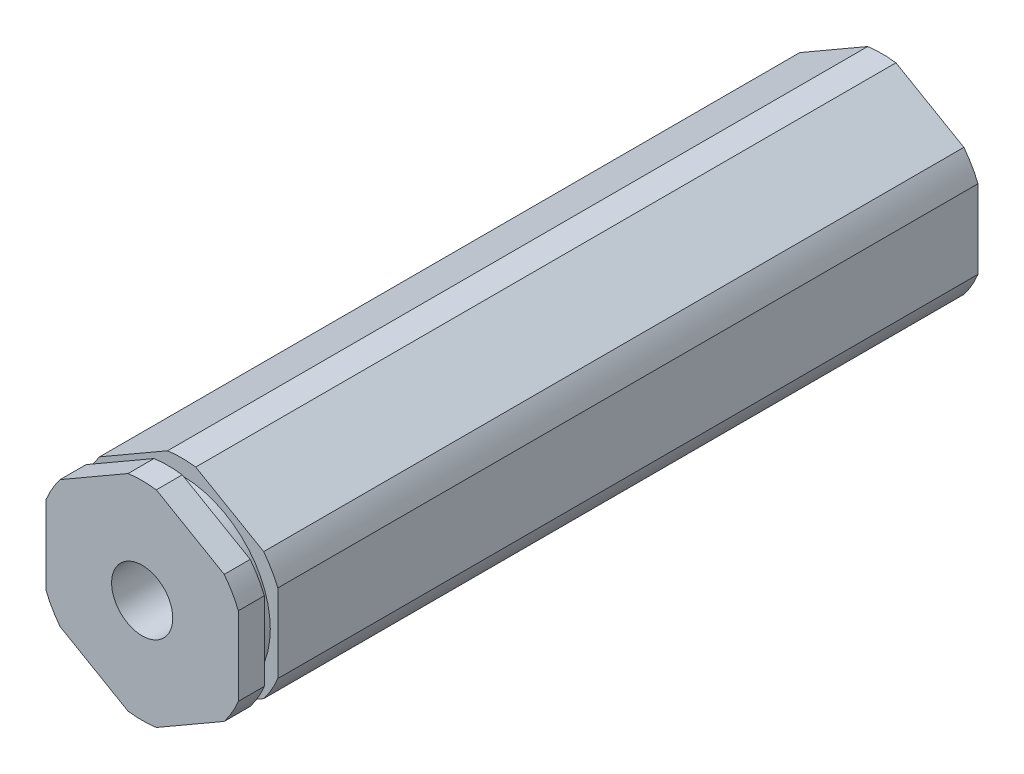
ISO-10303-21;
HEADER;
FILE_DESCRIPTION(('STEP AP214'),'2;1');
FILE_NAME('part.step','',(''),(''),'','','');
FILE_SCHEMA(('AUTOMOTIVE_DESIGN { 1 0 10303 214 1 1 1 1 }'));
ENDSEC;
DATA;
#1=APPLICATION_CONTEXT('core data for automotive mechanical design processes');
#2=APPLICATION_PROTOCOL_DEFINITION('international standard','automotive_design',2000,#1);
#3=PRODUCT_CONTEXT('',#1,'mechanical');
#4=PRODUCT('Part','Part','',(#3));
#5=PRODUCT_RELATED_PRODUCT_CATEGORY('part','',(#4));
#6=PRODUCT_DEFINITION_FORMATION('','',#4);
#7=PRODUCT_DEFINITION_CONTEXT('part definition',#1,'design');
#8=PRODUCT_DEFINITION('design','',#6,#7);
#9=PRODUCT_DEFINITION_SHAPE('','',#8);
#10=(LENGTH_UNIT() NAMED_UNIT(*) SI_UNIT(.MILLI.,.METRE.));
#11=(NAMED_UNIT(*) PLANE_ANGLE_UNIT() SI_UNIT($,.RADIAN.));
#12=(NAMED_UNIT(*) SI_UNIT($,.STERADIAN.) SOLID_ANGLE_UNIT());
#13=UNCERTAINTY_MEASURE_WITH_UNIT(LENGTH_MEASURE(1.E-05),#10,'distance_accuracy_value','');
#14=(GEOMETRIC_REPRESENTATION_CONTEXT(3) GLOBAL_UNCERTAINTY_ASSIGNED_CONTEXT((#13)) GLOBAL_UNIT_ASSIGNED_CONTEXT((#10,
#11,#12)) REPRESENTATION_CONTEXT('',''));
#15=CARTESIAN_POINT('',(0.,0.,0.));
#16=DIRECTION('',(0.,0.,1.));
#17=DIRECTION('',(1.,0.,0.));
#18=AXIS2_PLACEMENT_3D('',#15,#16,#17);
#19=CARTESIAN_POINT('',(6.35,0.,24.41575));
#20=DIRECTION('',(-1.,0.,0.));
#21=DIRECTION('',(0.,-1.,0.));
#22=AXIS2_PLACEMENT_3D('',#19,#20,#21);
#23=PLANE('',#22);
#24=DIRECTION('',(0.,-1.,0.));
#25=VECTOR('',#24,1.);
#26=CARTESIAN_POINT('',(6.35,0.,22.70125));
#27=LINE('',#26,#25);
#28=CARTESIAN_POINT('',(6.35,2.59030191290513,22.70125));
#29=VERTEX_POINT('',#28);
#30=CARTESIAN_POINT('',(6.35,-2.59030191290513,22.70125));
#31=VERTEX_POINT('',#30);
#32=EDGE_CURVE('E79',#29,#31,#27,.T.);
#33=ORIENTED_EDGE('',*,*,#32,.F.);
#34=DIRECTION('',(0.,0.,-1.));
#35=VECTOR('',#34,1.);
#36=CARTESIAN_POINT('',(6.35,2.59030191290513,24.41575));
#37=LINE('',#36,#35);
#38=CARTESIAN_POINT('',(6.35,2.59030191290513,24.41575));
#39=VERTEX_POINT('',#38);
#40=EDGE_CURVE('E250',#39,#29,#37,.T.);
#41=ORIENTED_EDGE('',*,*,#40,.F.);
#42=DIRECTION('',(0.,1.,0.));
#43=VECTOR('',#42,1.);
#44=CARTESIAN_POINT('',(6.35,0.,24.41575));
#45=LINE('',#44,#43);
#46=CARTESIAN_POINT('',(6.35,-2.59030191290513,24.41575));
#47=VERTEX_POINT('',#46);
#48=EDGE_CURVE('E364',#47,#39,#45,.T.);
#49=ORIENTED_EDGE('',*,*,#48,.F.);
#50=DIRECTION('',(0.,0.,-1.));
#51=VECTOR('',#50,1.);
#52=CARTESIAN_POINT('',(6.35,-2.59030191290513,24.41575));
#53=LINE('',#52,#51);
#54=EDGE_CURVE('E305',#47,#31,#53,.T.);
#55=ORIENTED_EDGE('',*,*,#54,.T.);
#56=EDGE_LOOP('',(#33,#41,#49,#55));
#57=FACE_BOUND('',#56,.T.);
#58=ADVANCED_FACE('F57',(#57),#23,.F.);
#59=CARTESIAN_POINT('',(0.,0.,24.41575));
#60=DIRECTION('',(0.,0.,-1.));
#61=DIRECTION('',(-1.,0.,0.));
#62=AXIS2_PLACEMENT_3D('',#59,#60,#61);
#63=CYLINDRICAL_SURFACE('',#62,6.858);
#64=CARTESIAN_POINT('',(0.,0.,22.70125));
#65=DIRECTION('',(0.,0.,1.));
#66=DIRECTION('',(1.,0.,0.));
#67=AXIS2_PLACEMENT_3D('',#64,#65,#66);
#68=CIRCLE('',#67,6.858);
#69=CARTESIAN_POINT('',(5.41826726004727,4.20411035757862,22.70125));
#70=VERTEX_POINT('',#69);
#71=EDGE_CURVE('E419',#29,#70,#68,.T.);
#72=ORIENTED_EDGE('',*,*,#71,.T.);
#73=DIRECTION('',(0.,0.,-1.));
#74=VECTOR('',#73,1.);
#75=CARTESIAN_POINT('',(5.41826726004727,4.20411035757862,24.41575));
#76=LINE('',#75,#74);
#77=CARTESIAN_POINT('',(5.41826726004727,4.20411035757862,24.41575));
#78=VERTEX_POINT('',#77);
#79=EDGE_CURVE('E251',#78,#70,#76,.T.);
#80=ORIENTED_EDGE('',*,*,#79,.F.);
#81=CARTESIAN_POINT('',(0.,0.,24.41575));
#82=DIRECTION('',(0.,0.,1.));
#83=DIRECTION('',(1.,0.,0.));
#84=AXIS2_PLACEMENT_3D('',#81,#82,#83);
#85=CIRCLE('',#84,6.858);
#86=EDGE_CURVE('E361',#39,#78,#85,.T.);
#87=ORIENTED_EDGE('',*,*,#86,.F.);
#88=ORIENTED_EDGE('',*,*,#40,.T.);
#89=EDGE_LOOP('',(#72,#80,#87,#88));
#90=FACE_BOUND('',#89,.T.);
#91=ADVANCED_FACE('F549',(#90),#63,.T.);
#92=CARTESIAN_POINT('',(3.175,5.49926131403119,24.41575));
#93=DIRECTION('',(-0.5,-0.866025403784439,0.));
#94=DIRECTION('',(0.866025403784438,-0.5,0.));
#95=AXIS2_PLACEMENT_3D('',#92,#93,#94);
#96=PLANE('',#95);
#97=DIRECTION('',(0.866025403784438,-0.5,0.));
#98=VECTOR('',#97,1.);
#99=CARTESIAN_POINT('',(3.175,5.49926131403119,22.70125));
#100=LINE('',#99,#98);
#101=CARTESIAN_POINT('',(0.931732739952733,6.79441227048375,22.70125));
#102=VERTEX_POINT('',#101);
#103=EDGE_CURVE('E385',#102,#70,#100,.T.);
#104=ORIENTED_EDGE('',*,*,#103,.F.);
#105=DIRECTION('',(0.,0.,-1.));
#106=VECTOR('',#105,1.);
#107=CARTESIAN_POINT('',(0.931732739952733,6.79441227048375,24.41575));
#108=LINE('',#107,#106);
#109=CARTESIAN_POINT('',(0.931732739952733,6.79441227048375,24.41575));
#110=VERTEX_POINT('',#109);
#111=EDGE_CURVE('E260',#110,#102,#108,.T.);
#112=ORIENTED_EDGE('',*,*,#111,.F.);
#113=DIRECTION('',(-0.866025403784439,0.5,0.));
#114=VECTOR('',#113,1.);
#115=CARTESIAN_POINT('',(3.175,5.49926131403119,24.41575));
#116=LINE('',#115,#114);
#117=EDGE_CURVE('E358',#78,#110,#116,.T.);
#118=ORIENTED_EDGE('',*,*,#117,.F.);
#119=ORIENTED_EDGE('',*,*,#79,.T.);
#120=EDGE_LOOP('',(#104,#112,#118,#119));
#121=FACE_BOUND('',#120,.T.);
#122=ADVANCED_FACE('F561',(#121),#96,.F.);
#123=CARTESIAN_POINT('',(-0.931732739952732,6.79441227048375,22.70125));
#124=VERTEX_POINT('',#123);
#125=EDGE_CURVE('E422',#102,#124,#68,.T.);
#126=ORIENTED_EDGE('',*,*,#125,.T.);
#127=DIRECTION('',(0.,0.,-1.));
#128=VECTOR('',#127,1.);
#129=CARTESIAN_POINT('',(-0.931732739952731,6.79441227048375,24.41575));
#130=LINE('',#129,#128);
#131=CARTESIAN_POINT('',(-0.931732739952731,6.79441227048375,24.41575));
#132=VERTEX_POINT('',#131);
#133=EDGE_CURVE('E265',#132,#124,#130,.T.);
#134=ORIENTED_EDGE('',*,*,#133,.F.);
#135=EDGE_CURVE('E357',#110,#132,#85,.T.);
#136=ORIENTED_EDGE('',*,*,#135,.F.);
#137=ORIENTED_EDGE('',*,*,#111,.T.);
#138=EDGE_LOOP('',(#126,#134,#136,#137));
#139=FACE_BOUND('',#138,.T.);
#140=ADVANCED_FACE('F566',(#139),#63,.T.);
#141=CARTESIAN_POINT('',(-3.175,5.49926131403119,24.41575));
#142=DIRECTION('',(0.5,-0.866025403784439,0.));
#143=DIRECTION('',(0.866025403784438,0.5,0.));
#144=AXIS2_PLACEMENT_3D('',#141,#142,#143);
#145=PLANE('',#144);
#146=DIRECTION('',(0.866025403784438,0.5,0.));
#147=VECTOR('',#146,1.);
#148=CARTESIAN_POINT('',(-3.175,5.49926131403119,22.70125));
#149=LINE('',#148,#147);
#150=CARTESIAN_POINT('',(-5.41826726004727,4.20411035757862,22.70125));
#151=VERTEX_POINT('',#150);
#152=EDGE_CURVE('E388',#151,#124,#149,.T.);
#153=ORIENTED_EDGE('',*,*,#152,.F.);
#154=DIRECTION('',(0.,0.,-1.));
#155=VECTOR('',#154,1.);
#156=CARTESIAN_POINT('',(-5.41826726004727,4.20411035757862,24.41575));
#157=LINE('',#156,#155);
#158=CARTESIAN_POINT('',(-5.41826726004727,4.20411035757862,24.41575));
#159=VERTEX_POINT('',#158);
#160=EDGE_CURVE('E270',#159,#151,#157,.T.);
#161=ORIENTED_EDGE('',*,*,#160,.F.);
#162=DIRECTION('',(-0.866025403784439,-0.5,0.));
#163=VECTOR('',#162,1.);
#164=CARTESIAN_POINT('',(-3.175,5.49926131403119,24.41575));
#165=LINE('',#164,#163);
#166=EDGE_CURVE('E354',#132,#159,#165,.T.);
#167=ORIENTED_EDGE('',*,*,#166,.F.);
#168=ORIENTED_EDGE('',*,*,#133,.T.);
#169=EDGE_LOOP('',(#153,#161,#167,#168));
#170=FACE_BOUND('',#169,.T.);
#171=ADVANCED_FACE('F571',(#170),#145,.F.);
#172=CARTESIAN_POINT('',(-6.35,2.59030191290514,22.70125));
#173=VERTEX_POINT('',#172);
#174=EDGE_CURVE('E430',#151,#173,#68,.T.);
#175=ORIENTED_EDGE('',*,*,#174,.T.);
#176=DIRECTION('',(0.,0.,-1.));
#177=VECTOR('',#176,1.);
#178=CARTESIAN_POINT('',(-6.35,2.59030191290514,24.41575));
#179=LINE('',#178,#177);
#180=CARTESIAN_POINT('',(-6.35,2.59030191290514,24.41575));
#181=VERTEX_POINT('',#180);
#182=EDGE_CURVE('E275',#181,#173,#179,.T.);
#183=ORIENTED_EDGE('',*,*,#182,.F.);
#184=EDGE_CURVE('E353',#159,#181,#85,.T.);
#185=ORIENTED_EDGE('',*,*,#184,.F.);
#186=ORIENTED_EDGE('',*,*,#160,.T.);
#187=EDGE_LOOP('',(#175,#183,#185,#186));
#188=FACE_BOUND('',#187,.T.);
#189=ADVANCED_FACE('F444',(#188),#63,.T.);
#190=CARTESIAN_POINT('',(-6.35,0.,24.41575));
#191=DIRECTION('',(1.,0.,0.));
#192=DIRECTION('',(0.,1.,0.));
#193=AXIS2_PLACEMENT_3D('',#190,#191,#192);
#194=PLANE('',#193);
#195=DIRECTION('',(0.,1.,0.));
#196=VECTOR('',#195,1.);
#197=CARTESIAN_POINT('',(-6.35,0.,22.70125));
#198=LINE('',#197,#196);
#199=CARTESIAN_POINT('',(-6.35,-2.59030191290514,22.70125));
#200=VERTEX_POINT('',#199);
#201=EDGE_CURVE('E391',#200,#173,#198,.T.);
#202=ORIENTED_EDGE('',*,*,#201,.F.);
#203=DIRECTION('',(0.,0.,-1.));
#204=VECTOR('',#203,1.);
#205=CARTESIAN_POINT('',(-6.35,-2.59030191290514,24.41575));
#206=LINE('',#205,#204);
#207=CARTESIAN_POINT('',(-6.35,-2.59030191290514,24.41575));
#208=VERTEX_POINT('',#207);
#209=EDGE_CURVE('E280',#208,#200,#206,.T.);
#210=ORIENTED_EDGE('',*,*,#209,.F.);
#211=DIRECTION('',(0.,-1.,0.));
#212=VECTOR('',#211,1.);
#213=CARTESIAN_POINT('',(-6.35,0.,24.41575));
#214=LINE('',#213,#212);
#215=EDGE_CURVE('E350',#181,#208,#214,.T.);
#216=ORIENTED_EDGE('',*,*,#215,.F.);
#217=ORIENTED_EDGE('',*,*,#182,.T.);
#218=EDGE_LOOP('',(#202,#210,#216,#217));
#219=FACE_BOUND('',#218,.T.);
#220=ADVANCED_FACE('F451',(#219),#194,.F.);
#221=CARTESIAN_POINT('',(-5.41826726004727,-4.20411035757862,22.70125));
#222=VERTEX_POINT('',#221);
#223=EDGE_CURVE('E433',#200,#222,#68,.T.);
#224=ORIENTED_EDGE('',*,*,#223,.T.);
#225=DIRECTION('',(0.,0.,-1.));
#226=VECTOR('',#225,1.);
#227=CARTESIAN_POINT('',(-5.41826726004728,-4.20411035757862,24.41575));
#228=LINE('',#227,#226);
#229=CARTESIAN_POINT('',(-5.41826726004728,-4.20411035757862,24.41575));
#230=VERTEX_POINT('',#229);
#231=EDGE_CURVE('E285',#230,#222,#228,.T.);
#232=ORIENTED_EDGE('',*,*,#231,.F.);
#233=EDGE_CURVE('E349',#208,#230,#85,.T.);
#234=ORIENTED_EDGE('',*,*,#233,.F.);
#235=ORIENTED_EDGE('',*,*,#209,.T.);
#236=EDGE_LOOP('',(#224,#232,#234,#235));
#237=FACE_BOUND('',#236,.T.);
#238=ADVANCED_FACE('F540',(#237),#63,.T.);
#239=CARTESIAN_POINT('',(-3.175,-5.49926131403118,24.41575));
#240=DIRECTION('',(0.5,0.866025403784439,0.));
#241=DIRECTION('',(-0.866025403784439,0.5,0.));
#242=AXIS2_PLACEMENT_3D('',#239,#240,#241);
#243=PLANE('',#242);
#244=DIRECTION('',(-0.866025403784439,0.5,0.));
#245=VECTOR('',#244,1.);
#246=CARTESIAN_POINT('',(-3.175,-5.49926131403118,22.70125));
#247=LINE('',#246,#245);
#248=CARTESIAN_POINT('',(-0.931732739952721,-6.79441227048375,22.70125));
#249=VERTEX_POINT('',#248);
#250=EDGE_CURVE('E394',#249,#222,#247,.T.);
#251=ORIENTED_EDGE('',*,*,#250,.F.);
#252=DIRECTION('',(0.,0.,-1.));
#253=VECTOR('',#252,1.);
#254=CARTESIAN_POINT('',(-0.931732739952721,-6.79441227048375,24.41575));
#255=LINE('',#254,#253);
#256=CARTESIAN_POINT('',(-0.931732739952721,-6.79441227048375,24.41575));
#257=VERTEX_POINT('',#256);
#258=EDGE_CURVE('E290',#257,#249,#255,.T.);
#259=ORIENTED_EDGE('',*,*,#258,.F.);
#260=DIRECTION('',(0.866025403784439,-0.5,0.));
#261=VECTOR('',#260,1.);
#262=CARTESIAN_POINT('',(-3.175,-5.49926131403118,24.41575));
#263=LINE('',#262,#261);
#264=EDGE_CURVE('E346',#230,#257,#263,.T.);
#265=ORIENTED_EDGE('',*,*,#264,.F.);
#266=ORIENTED_EDGE('',*,*,#231,.T.);
#267=EDGE_LOOP('',(#251,#259,#265,#266));
#268=FACE_BOUND('',#267,.T.);
#269=ADVANCED_FACE('F548',(#268),#243,.F.);
#270=CARTESIAN_POINT('',(0.931732739952729,-6.79441227048375,22.70125));
#271=VERTEX_POINT('',#270);
#272=EDGE_CURVE('E423',#249,#271,#68,.T.);
#273=ORIENTED_EDGE('',*,*,#272,.T.);
#274=DIRECTION('',(0.,0.,-1.));
#275=VECTOR('',#274,1.);
#276=CARTESIAN_POINT('',(0.931732739952731,-6.79441227048375,24.41575));
#277=LINE('',#276,#275);
#278=CARTESIAN_POINT('',(0.931732739952731,-6.79441227048375,24.41575));
#279=VERTEX_POINT('',#278);
#280=EDGE_CURVE('E295',#279,#271,#277,.T.);
#281=ORIENTED_EDGE('',*,*,#280,.F.);
#282=EDGE_CURVE('E345',#257,#279,#85,.T.);
#283=ORIENTED_EDGE('',*,*,#282,.F.);
#284=ORIENTED_EDGE('',*,*,#258,.T.);
#285=EDGE_LOOP('',(#273,#281,#283,#284));
#286=FACE_BOUND('',#285,.T.);
#287=ADVANCED_FACE('F539',(#286),#63,.T.);
#288=CARTESIAN_POINT('',(3.175,-5.49926131403118,24.41575));
#289=DIRECTION('',(-0.5,0.866025403784439,0.));
#290=DIRECTION('',(-0.866025403784439,-0.5,0.));
#291=AXIS2_PLACEMENT_3D('',#288,#289,#290);
#292=PLANE('',#291);
#293=DIRECTION('',(-0.866025403784439,-0.5,0.));
#294=VECTOR('',#293,1.);
#295=CARTESIAN_POINT('',(3.175,-5.49926131403118,22.70125));
#296=LINE('',#295,#294);
#297=CARTESIAN_POINT('',(5.41826726004727,-4.20411035757862,22.70125));
#298=VERTEX_POINT('',#297);
#299=EDGE_CURVE('E230',#298,#271,#296,.T.);
#300=ORIENTED_EDGE('',*,*,#299,.F.);
#301=DIRECTION('',(0.,0.,-1.));
#302=VECTOR('',#301,1.);
#303=CARTESIAN_POINT('',(5.41826726004727,-4.20411035757862,24.41575));
#304=LINE('',#303,#302);
#305=CARTESIAN_POINT('',(5.41826726004727,-4.20411035757862,24.41575));
#306=VERTEX_POINT('',#305);
#307=EDGE_CURVE('E300',#306,#298,#304,.T.);
#308=ORIENTED_EDGE('',*,*,#307,.F.);
#309=DIRECTION('',(0.866025403784439,0.5,0.));
#310=VECTOR('',#309,1.);
#311=CARTESIAN_POINT('',(3.175,-5.49926131403118,24.41575));
#312=LINE('',#311,#310);
#313=EDGE_CURVE('E341',#279,#306,#312,.T.);
#314=ORIENTED_EDGE('',*,*,#313,.F.);
#315=ORIENTED_EDGE('',*,*,#280,.T.);
#316=EDGE_LOOP('',(#300,#308,#314,#315));
#317=FACE_BOUND('',#316,.T.);
#318=ADVANCED_FACE('F553',(#317),#292,.F.);
#319=CARTESIAN_POINT('',(0.,0.,22.70125));
#320=DIRECTION('',(0.,0.,-1.));
#321=DIRECTION('',(-1.,0.,0.));
#322=AXIS2_PLACEMENT_3D('',#319,#320,#321);
#323=CIRCLE('',#322,6.858);
#324=EDGE_CURVE('E11',#31,#298,#323,.T.);
#325=ORIENTED_EDGE('',*,*,#324,.F.);
#326=ORIENTED_EDGE('',*,*,#54,.F.);
#327=EDGE_CURVE('E344',#306,#47,#85,.T.);
#328=ORIENTED_EDGE('',*,*,#327,.F.);
#329=ORIENTED_EDGE('',*,*,#307,.T.);
#330=EDGE_LOOP('',(#325,#326,#328,#329));
#331=FACE_BOUND('',#330,.T.);
#332=ADVANCED_FACE('F682',(#331),#63,.T.);
#333=CARTESIAN_POINT('',(0.,0.,24.41575));
#334=DIRECTION('',(0.,0.,1.));
#335=DIRECTION('',(1.,0.,0.));
#336=AXIS2_PLACEMENT_3D('',#333,#334,#335);
#337=PLANE('',#336);
#338=CARTESIAN_POINT('',(0.,0.,24.41575));
#339=DIRECTION('',(0.,0.,1.));
#340=DIRECTION('',(1.,0.,0.));
#341=AXIS2_PLACEMENT_3D('',#338,#339,#340);
#342=CIRCLE('',#341,2.01929999999999);
#343=CARTESIAN_POINT('',(2.01929999999999,0.,24.41575));
#344=VERTEX_POINT('',#343);
#345=EDGE_CURVE('E379',#344,#344,#342,.T.);
#346=ORIENTED_EDGE('',*,*,#345,.F.);
#347=EDGE_LOOP('',(#346));
#348=FACE_BOUND('',#347,.T.);
#349=ORIENTED_EDGE('',*,*,#48,.T.);
#350=ORIENTED_EDGE('',*,*,#86,.T.);
#351=ORIENTED_EDGE('',*,*,#117,.T.);
#352=ORIENTED_EDGE('',*,*,#135,.T.);
#353=ORIENTED_EDGE('',*,*,#166,.T.);
#354=ORIENTED_EDGE('',*,*,#184,.T.);
#355=ORIENTED_EDGE('',*,*,#215,.T.);
#356=ORIENTED_EDGE('',*,*,#233,.T.);
#357=ORIENTED_EDGE('',*,*,#264,.T.);
#358=ORIENTED_EDGE('',*,*,#282,.T.);
#359=ORIENTED_EDGE('',*,*,#313,.T.);
#360=ORIENTED_EDGE('',*,*,#327,.T.);
#361=EDGE_LOOP('',(#349,#350,#351,#352,#353,#354,#355,#356,#357,#358,#359,#360));
#362=FACE_BOUND('',#361,.T.);
#363=ADVANCED_FACE('F455',(#348,#362),#337,.T.);
#364=CARTESIAN_POINT('',(0.,0.,8.06831000000001));
#365=DIRECTION('',(0.,0.,1.));
#366=DIRECTION('',(1.,0.,0.));
#367=AXIS2_PLACEMENT_3D('',#364,#365,#366);
#368=CONICAL_SURFACE('',#367,2.01929999999999,1.02974425867665);
#369=CARTESIAN_POINT('',(0.,0.,6.85499215199765));
#370=VERTEX_POINT('',#369);
#371=VERTEX_LOOP('',#370);
#372=FACE_BOUND('',#371,.T.);
#373=CARTESIAN_POINT('',(0.,0.,8.06831000000001));
#374=DIRECTION('',(0.,0.,1.));
#375=DIRECTION('',(1.,0.,0.));
#376=AXIS2_PLACEMENT_3D('',#373,#374,#375);
#377=CIRCLE('',#376,2.01929999999999);
#378=CARTESIAN_POINT('',(2.01929999999999,0.,8.06831000000001));
#379=VERTEX_POINT('',#378);
#380=EDGE_CURVE('E375',#379,#379,#377,.T.);
#381=ORIENTED_EDGE('',*,*,#380,.T.);
#382=EDGE_LOOP('',(#381));
#383=FACE_BOUND('',#382,.T.);
#384=ADVANCED_FACE('F766',(#372,#383),#368,.F.);
#385=CARTESIAN_POINT('',(0.,0.,24.41575));
#386=DIRECTION('',(0.,0.,1.));
#387=DIRECTION('',(1.,0.,0.));
#388=AXIS2_PLACEMENT_3D('',#385,#386,#387);
#389=CYLINDRICAL_SURFACE('',#388,2.01929999999999);
#390=ORIENTED_EDGE('',*,*,#380,.F.);
#391=EDGE_LOOP('',(#390));
#392=FACE_BOUND('',#391,.T.);
#393=ORIENTED_EDGE('',*,*,#345,.T.);
#394=EDGE_LOOP('',(#393));
#395=FACE_BOUND('',#394,.T.);
#396=ADVANCED_FACE('F654',(#392,#395),#389,.F.);
#397=CARTESIAN_POINT('',(0.,6.858,22.70125));
#398=DIRECTION('',(0.,0.,-1.));
#399=DIRECTION('',(-1.,0.,0.));
#400=AXIS2_PLACEMENT_3D('',#397,#398,#399);
#401=PLANE('',#400);
#402=CARTESIAN_POINT('',(0.,0.,22.70125));
#403=DIRECTION('',(0.,0.,1.));
#404=DIRECTION('',(1.,0.,0.));
#405=AXIS2_PLACEMENT_3D('',#402,#403,#404);
#406=CIRCLE('',#405,5.8547);
#407=CARTESIAN_POINT('',(5.8547,0.,22.70125));
#408=VERTEX_POINT('',#407);
#409=EDGE_CURVE('E412',#408,#408,#406,.T.);
#410=ORIENTED_EDGE('',*,*,#409,.T.);
#411=EDGE_LOOP('',(#410));
#412=FACE_BOUND('',#411,.T.);
#413=ORIENTED_EDGE('',*,*,#32,.T.);
#414=ORIENTED_EDGE('',*,*,#324,.T.);
#415=ORIENTED_EDGE('',*,*,#299,.T.);
#416=ORIENTED_EDGE('',*,*,#272,.F.);
#417=ORIENTED_EDGE('',*,*,#250,.T.);
#418=ORIENTED_EDGE('',*,*,#223,.F.);
#419=ORIENTED_EDGE('',*,*,#201,.T.);
#420=ORIENTED_EDGE('',*,*,#174,.F.);
#421=ORIENTED_EDGE('',*,*,#152,.T.);
#422=ORIENTED_EDGE('',*,*,#125,.F.);
#423=ORIENTED_EDGE('',*,*,#103,.T.);
#424=ORIENTED_EDGE('',*,*,#71,.F.);
#425=EDGE_LOOP('',(#413,#414,#415,#416,#417,#418,#419,#420,#421,#422,#423,#424));
#426=FACE_BOUND('',#425,.T.);
#427=ADVANCED_FACE('F650',(#412,#426),#401,.T.);
#428=CARTESIAN_POINT('',(0.,6.858,21.81225));
#429=DIRECTION('',(0.,0.,1.));
#430=DIRECTION('',(1.,0.,0.));
#431=AXIS2_PLACEMENT_3D('',#428,#429,#430);
#432=PLANE('',#431);
#433=CARTESIAN_POINT('',(0.,0.,21.81225));
#434=DIRECTION('',(0.,0.,1.));
#435=DIRECTION('',(1.,0.,0.));
#436=AXIS2_PLACEMENT_3D('',#433,#434,#435);
#437=CIRCLE('',#436,5.8547);
#438=CARTESIAN_POINT('',(5.8547,0.,21.81225));
#439=VERTEX_POINT('',#438);
#440=EDGE_CURVE('E241',#439,#439,#437,.T.);
#441=ORIENTED_EDGE('',*,*,#440,.F.);
#442=EDGE_LOOP('',(#441));
#443=FACE_BOUND('',#442,.T.);
#444=DIRECTION('',(0.,1.,0.));
#445=VECTOR('',#444,1.);
#446=CARTESIAN_POINT('',(6.35,0.,21.81225));
#447=LINE('',#446,#445);
#448=CARTESIAN_POINT('',(6.35,-2.59030191290513,21.81225));
#449=VERTEX_POINT('',#448);
#450=CARTESIAN_POINT('',(6.35,2.59030191290513,21.81225));
#451=VERTEX_POINT('',#450);
#452=EDGE_CURVE('E221',#449,#451,#447,.T.);
#453=ORIENTED_EDGE('',*,*,#452,.T.);
#454=CARTESIAN_POINT('',(0.,0.,21.81225));
#455=DIRECTION('',(0.,0.,1.));
#456=DIRECTION('',(1.,0.,0.));
#457=AXIS2_PLACEMENT_3D('',#454,#455,#456);
#458=CIRCLE('',#457,6.858);
#459=CARTESIAN_POINT('',(5.41826726004727,4.20411035757862,21.81225));
#460=VERTEX_POINT('',#459);
#461=EDGE_CURVE('E224',#451,#460,#458,.T.);
#462=ORIENTED_EDGE('',*,*,#461,.T.);
#463=DIRECTION('',(-0.866025403784438,0.5,0.));
#464=VECTOR('',#463,1.);
#465=CARTESIAN_POINT('',(3.175,5.49926131403119,21.81225));
#466=LINE('',#465,#464);
#467=CARTESIAN_POINT('',(0.931732739952733,6.79441227048375,21.81225));
#468=VERTEX_POINT('',#467);
#469=EDGE_CURVE('E231',#460,#468,#466,.T.);
#470=ORIENTED_EDGE('',*,*,#469,.T.);
#471=CARTESIAN_POINT('',(-0.931732739952732,6.79441227048375,21.81225));
#472=VERTEX_POINT('',#471);
#473=EDGE_CURVE('E242',#468,#472,#458,.T.);
#474=ORIENTED_EDGE('',*,*,#473,.T.);
#475=DIRECTION('',(-0.866025403784438,-0.5,0.));
#476=VECTOR('',#475,1.);
#477=CARTESIAN_POINT('',(-3.175,5.49926131403119,21.81225));
#478=LINE('',#477,#476);
#479=CARTESIAN_POINT('',(-5.41826726004727,4.20411035757862,21.81225));
#480=VERTEX_POINT('',#479);
#481=EDGE_CURVE('E401',#472,#480,#478,.T.);
#482=ORIENTED_EDGE('',*,*,#481,.T.);
#483=CARTESIAN_POINT('',(-6.35,2.59030191290514,21.81225));
#484=VERTEX_POINT('',#483);
#485=EDGE_CURVE('E524',#480,#484,#458,.T.);
#486=ORIENTED_EDGE('',*,*,#485,.T.);
#487=DIRECTION('',(0.,-1.,0.));
#488=VECTOR('',#487,1.);
#489=CARTESIAN_POINT('',(-6.35,0.,21.81225));
#490=LINE('',#489,#488);
#491=CARTESIAN_POINT('',(-6.35,-2.59030191290514,21.81225));
#492=VERTEX_POINT('',#491);
#493=EDGE_CURVE('E404',#484,#492,#490,.T.);
#494=ORIENTED_EDGE('',*,*,#493,.T.);
#495=CARTESIAN_POINT('',(-5.41826726004727,-4.20411035757862,21.81225));
#496=VERTEX_POINT('',#495);
#497=EDGE_CURVE('E428',#492,#496,#458,.T.);
#498=ORIENTED_EDGE('',*,*,#497,.T.);
#499=DIRECTION('',(0.866025403784439,-0.5,0.));
#500=VECTOR('',#499,1.);
#501=CARTESIAN_POINT('',(-3.175,-5.49926131403118,21.81225));
#502=LINE('',#501,#500);
#503=CARTESIAN_POINT('',(-0.931732739952721,-6.79441227048375,21.81225));
#504=VERTEX_POINT('',#503);
#505=EDGE_CURVE('E407',#496,#504,#502,.T.);
#506=ORIENTED_EDGE('',*,*,#505,.T.);
#507=CARTESIAN_POINT('',(0.931732739952729,-6.79441227048375,21.81225));
#508=VERTEX_POINT('',#507);
#509=EDGE_CURVE('E244',#504,#508,#458,.T.);
#510=ORIENTED_EDGE('',*,*,#509,.T.);
#511=DIRECTION('',(0.866025403784439,0.5,0.));
#512=VECTOR('',#511,1.);
#513=CARTESIAN_POINT('',(3.175,-5.49926131403118,21.81225));
#514=LINE('',#513,#512);
#515=CARTESIAN_POINT('',(5.41826726004727,-4.20411035757862,21.81225));
#516=VERTEX_POINT('',#515);
#517=EDGE_CURVE('E72',#508,#516,#514,.T.);
#518=ORIENTED_EDGE('',*,*,#517,.T.);
#519=CARTESIAN_POINT('',(0.,0.,21.81225));
#520=DIRECTION('',(0.,0.,1.));
#521=DIRECTION('',(1.,0.,0.));
#522=AXIS2_PLACEMENT_3D('',#519,#520,#521);
#523=CIRCLE('',#522,6.858);
#524=EDGE_CURVE('E65',#516,#449,#523,.T.);
#525=ORIENTED_EDGE('',*,*,#524,.T.);
#526=EDGE_LOOP('',(#453,#462,#470,#474,#482,#486,#494,#498,#506,#510,#518,#525));
#527=FACE_BOUND('',#526,.T.);
#528=ADVANCED_FACE('F223',(#443,#527),#432,.T.);
#529=CARTESIAN_POINT('',(0.,0.,165.047176272324));
#530=DIRECTION('',(0.,0.,1.));
#531=DIRECTION('',(1.,0.,0.));
#532=AXIS2_PLACEMENT_3D('',#529,#530,#531);
#533=CYLINDRICAL_SURFACE('',#532,5.8547);
#534=ORIENTED_EDGE('',*,*,#440,.T.);
#535=EDGE_LOOP('',(#534));
#536=FACE_BOUND('',#535,.T.);
#537=ORIENTED_EDGE('',*,*,#409,.F.);
#538=EDGE_LOOP('',(#537));
#539=FACE_BOUND('',#538,.T.);
#540=ADVANCED_FACE('F663',(#536,#539),#533,.T.);
#541=CARTESIAN_POINT('',(0.,0.,-8.06831000000001));
#542=DIRECTION('',(0.,0.,-1.));
#543=DIRECTION('',(-1.,0.,0.));
#544=AXIS2_PLACEMENT_3D('',#541,#542,#543);
#545=CONICAL_SURFACE('',#544,2.01929999999999,1.02974425867665);
#546=CARTESIAN_POINT('',(0.,0.,-6.85499215199765));
#547=VERTEX_POINT('',#546);
#548=VERTEX_LOOP('',#547);
#549=FACE_BOUND('',#548,.T.);
#550=CARTESIAN_POINT('',(0.,0.,-8.06831000000001));
#551=DIRECTION('',(0.,0.,-1.));
#552=DIRECTION('',(-1.,0.,0.));
#553=AXIS2_PLACEMENT_3D('',#550,#551,#552);
#554=CIRCLE('',#553,2.01929999999999);
#555=CARTESIAN_POINT('',(-2.01929999999999,0.,-8.06831000000001));
#556=VERTEX_POINT('',#555);
#557=EDGE_CURVE('E340',#556,#556,#554,.T.);
#558=ORIENTED_EDGE('',*,*,#557,.T.);
#559=EDGE_LOOP('',(#558));
#560=FACE_BOUND('',#559,.T.);
#561=ADVANCED_FACE('F671',(#549,#560),#545,.F.);
#562=CARTESIAN_POINT('',(0.,0.,-24.41575));
#563=DIRECTION('',(0.,0.,-1.));
#564=DIRECTION('',(-1.,0.,0.));
#565=AXIS2_PLACEMENT_3D('',#562,#563,#564);
#566=CYLINDRICAL_SURFACE('',#565,2.01929999999999);
#567=ORIENTED_EDGE('',*,*,#557,.F.);
#568=EDGE_LOOP('',(#567));
#569=FACE_BOUND('',#568,.T.);
#570=CARTESIAN_POINT('',(0.,0.,-24.41575));
#571=DIRECTION('',(0.,0.,-1.));
#572=DIRECTION('',(-1.,0.,0.));
#573=AXIS2_PLACEMENT_3D('',#570,#571,#572);
#574=CIRCLE('',#573,2.01929999999999);
#575=CARTESIAN_POINT('',(-2.01929999999999,0.,-24.41575));
#576=VERTEX_POINT('',#575);
#577=EDGE_CURVE('E371',#576,#576,#574,.T.);
#578=ORIENTED_EDGE('',*,*,#577,.T.);
#579=EDGE_LOOP('',(#578));
#580=FACE_BOUND('',#579,.T.);
#581=ADVANCED_FACE('F783',(#569,#580),#566,.F.);
#582=CARTESIAN_POINT('',(0.,0.,-24.41575));
#583=DIRECTION('',(0.,0.,1.));
#584=DIRECTION('',(1.,0.,0.));
#585=AXIS2_PLACEMENT_3D('',#582,#583,#584);
#586=PLANE('',#585);
#587=ORIENTED_EDGE('',*,*,#577,.F.);
#588=EDGE_LOOP('',(#587));
#589=FACE_BOUND('',#588,.T.);
#590=DIRECTION('',(0.,1.,0.));
#591=VECTOR('',#590,1.);
#592=CARTESIAN_POINT('',(6.35,0.,-24.41575));
#593=LINE('',#592,#591);
#594=CARTESIAN_POINT('',(6.35,-2.59030191290513,-24.41575));
#595=VERTEX_POINT('',#594);
#596=CARTESIAN_POINT('',(6.35,2.59030191290513,-24.41575));
#597=VERTEX_POINT('',#596);
#598=EDGE_CURVE('E248',#595,#597,#593,.T.);
#599=ORIENTED_EDGE('',*,*,#598,.F.);
#600=CARTESIAN_POINT('',(0.,0.,-24.41575));
#601=DIRECTION('',(0.,0.,1.));
#602=DIRECTION('',(1.,0.,0.));
#603=AXIS2_PLACEMENT_3D('',#600,#601,#602);
#604=CIRCLE('',#603,6.858);
#605=CARTESIAN_POINT('',(5.41826726004727,-4.20411035757862,-24.41575));
#606=VERTEX_POINT('',#605);
#607=EDGE_CURVE('E314',#606,#595,#604,.T.);
#608=ORIENTED_EDGE('',*,*,#607,.F.);
#609=DIRECTION('',(0.866025403784439,0.5,0.));
#610=VECTOR('',#609,1.);
#611=CARTESIAN_POINT('',(3.175,-5.49926131403118,-24.41575));
#612=LINE('',#611,#610);
#613=CARTESIAN_POINT('',(0.931732739952731,-6.79441227048375,-24.41575));
#614=VERTEX_POINT('',#613);
#615=EDGE_CURVE('E310',#614,#606,#612,.T.);
#616=ORIENTED_EDGE('',*,*,#615,.F.);
#617=CARTESIAN_POINT('',(-0.931732739952721,-6.79441227048375,-24.41575));
#618=VERTEX_POINT('',#617);
#619=EDGE_CURVE('E315',#618,#614,#604,.T.);
#620=ORIENTED_EDGE('',*,*,#619,.F.);
#621=DIRECTION('',(0.866025403784439,-0.5,0.));
#622=VECTOR('',#621,1.);
#623=CARTESIAN_POINT('',(-3.175,-5.49926131403118,-24.41575));
#624=LINE('',#623,#622);
#625=CARTESIAN_POINT('',(-5.41826726004728,-4.20411035757862,-24.41575));
#626=VERTEX_POINT('',#625);
#627=EDGE_CURVE('E316',#626,#618,#624,.T.);
#628=ORIENTED_EDGE('',*,*,#627,.F.);
#629=CARTESIAN_POINT('',(-6.35,-2.59030191290514,-24.41575));
#630=VERTEX_POINT('',#629);
#631=EDGE_CURVE('E320',#630,#626,#604,.T.);
#632=ORIENTED_EDGE('',*,*,#631,.F.);
#633=DIRECTION('',(0.,-1.,0.));
#634=VECTOR('',#633,1.);
#635=CARTESIAN_POINT('',(-6.35,0.,-24.41575));
#636=LINE('',#635,#634);
#637=CARTESIAN_POINT('',(-6.35,2.59030191290514,-24.41575));
#638=VERTEX_POINT('',#637);
#639=EDGE_CURVE('E321',#638,#630,#636,.T.);
#640=ORIENTED_EDGE('',*,*,#639,.F.);
#641=CARTESIAN_POINT('',(-5.41826726004727,4.20411035757862,-24.41575));
#642=VERTEX_POINT('',#641);
#643=EDGE_CURVE('E325',#642,#638,#604,.T.);
#644=ORIENTED_EDGE('',*,*,#643,.F.);
#645=DIRECTION('',(-0.866025403784439,-0.5,0.));
#646=VECTOR('',#645,1.);
#647=CARTESIAN_POINT('',(-3.175,5.49926131403119,-24.41575));
#648=LINE('',#647,#646);
#649=CARTESIAN_POINT('',(-0.931732739952731,6.79441227048375,-24.41575));
#650=VERTEX_POINT('',#649);
#651=EDGE_CURVE('E326',#650,#642,#648,.T.);
#652=ORIENTED_EDGE('',*,*,#651,.F.);
#653=CARTESIAN_POINT('',(0.931732739952733,6.79441227048375,-24.41575));
#654=VERTEX_POINT('',#653);
#655=EDGE_CURVE('E330',#654,#650,#604,.T.);
#656=ORIENTED_EDGE('',*,*,#655,.F.);
#657=DIRECTION('',(-0.866025403784439,0.5,0.));
#658=VECTOR('',#657,1.);
#659=CARTESIAN_POINT('',(3.175,5.49926131403119,-24.41575));
#660=LINE('',#659,#658);
#661=CARTESIAN_POINT('',(5.41826726004727,4.20411035757862,-24.41575));
#662=VERTEX_POINT('',#661);
#663=EDGE_CURVE('E331',#662,#654,#660,.T.);
#664=ORIENTED_EDGE('',*,*,#663,.F.);
#665=EDGE_CURVE('E335',#597,#662,#604,.T.);
#666=ORIENTED_EDGE('',*,*,#665,.F.);
#667=EDGE_LOOP('',(#599,#608,#616,#620,#628,#632,#640,#644,#652,#656,#664,#666));
#668=FACE_BOUND('',#667,.T.);
#669=ADVANCED_FACE('F474',(#589,#668),#586,.F.);
#670=ORIENTED_EDGE('',*,*,#524,.F.);
#671=EDGE_CURVE('E304',#516,#606,#304,.T.);
#672=ORIENTED_EDGE('',*,*,#671,.T.);
#673=ORIENTED_EDGE('',*,*,#607,.T.);
#674=EDGE_CURVE('E309',#449,#595,#53,.T.);
#675=ORIENTED_EDGE('',*,*,#674,.F.);
#676=EDGE_LOOP('',(#670,#672,#673,#675));
#677=FACE_BOUND('',#676,.T.);
#678=ADVANCED_FACE('F469',(#677),#63,.T.);
#679=ORIENTED_EDGE('',*,*,#517,.F.);
#680=EDGE_CURVE('E299',#508,#614,#277,.T.);
#681=ORIENTED_EDGE('',*,*,#680,.T.);
#682=ORIENTED_EDGE('',*,*,#615,.T.);
#683=ORIENTED_EDGE('',*,*,#671,.F.);
#684=EDGE_LOOP('',(#679,#681,#682,#683));
#685=FACE_BOUND('',#684,.T.);
#686=ADVANCED_FACE('F495',(#685),#292,.F.);
#687=ORIENTED_EDGE('',*,*,#509,.F.);
#688=EDGE_CURVE('E294',#504,#618,#255,.T.);
#689=ORIENTED_EDGE('',*,*,#688,.T.);
#690=ORIENTED_EDGE('',*,*,#619,.T.);
#691=ORIENTED_EDGE('',*,*,#680,.F.);
#692=EDGE_LOOP('',(#687,#689,#690,#691));
#693=FACE_BOUND('',#692,.T.);
#694=ADVANCED_FACE('F499',(#693),#63,.T.);
#695=ORIENTED_EDGE('',*,*,#505,.F.);
#696=EDGE_CURVE('E289',#496,#626,#228,.T.);
#697=ORIENTED_EDGE('',*,*,#696,.T.);
#698=ORIENTED_EDGE('',*,*,#627,.T.);
#699=ORIENTED_EDGE('',*,*,#688,.F.);
#700=EDGE_LOOP('',(#695,#697,#698,#699));
#701=FACE_BOUND('',#700,.T.);
#702=ADVANCED_FACE('F534',(#701),#243,.F.);
#703=ORIENTED_EDGE('',*,*,#497,.F.);
#704=EDGE_CURVE('E284',#492,#630,#206,.T.);
#705=ORIENTED_EDGE('',*,*,#704,.T.);
#706=ORIENTED_EDGE('',*,*,#631,.T.);
#707=ORIENTED_EDGE('',*,*,#696,.F.);
#708=EDGE_LOOP('',(#703,#705,#706,#707));
#709=FACE_BOUND('',#708,.T.);
#710=ADVANCED_FACE('F535',(#709),#63,.T.);
#711=ORIENTED_EDGE('',*,*,#493,.F.);
#712=EDGE_CURVE('E279',#484,#638,#179,.T.);
#713=ORIENTED_EDGE('',*,*,#712,.T.);
#714=ORIENTED_EDGE('',*,*,#639,.T.);
#715=ORIENTED_EDGE('',*,*,#704,.F.);
#716=EDGE_LOOP('',(#711,#713,#714,#715));
#717=FACE_BOUND('',#716,.T.);
#718=ADVANCED_FACE('F537',(#717),#194,.F.);
#719=ORIENTED_EDGE('',*,*,#485,.F.);
#720=EDGE_CURVE('E274',#480,#642,#157,.T.);
#721=ORIENTED_EDGE('',*,*,#720,.T.);
#722=ORIENTED_EDGE('',*,*,#643,.T.);
#723=ORIENTED_EDGE('',*,*,#712,.F.);
#724=EDGE_LOOP('',(#719,#721,#722,#723));
#725=FACE_BOUND('',#724,.T.);
#726=ADVANCED_FACE('F526',(#725),#63,.T.);
#727=ORIENTED_EDGE('',*,*,#481,.F.);
#728=EDGE_CURVE('E269',#472,#650,#130,.T.);
#729=ORIENTED_EDGE('',*,*,#728,.T.);
#730=ORIENTED_EDGE('',*,*,#651,.T.);
#731=ORIENTED_EDGE('',*,*,#720,.F.);
#732=EDGE_LOOP('',(#727,#729,#730,#731));
#733=FACE_BOUND('',#732,.T.);
#734=ADVANCED_FACE('F522',(#733),#145,.F.);
#735=ORIENTED_EDGE('',*,*,#473,.F.);
#736=EDGE_CURVE('E264',#468,#654,#108,.T.);
#737=ORIENTED_EDGE('',*,*,#736,.T.);
#738=ORIENTED_EDGE('',*,*,#655,.T.);
#739=ORIENTED_EDGE('',*,*,#728,.F.);
#740=EDGE_LOOP('',(#735,#737,#738,#739));
#741=FACE_BOUND('',#740,.T.);
#742=ADVANCED_FACE('F518',(#741),#63,.T.);
#743=ORIENTED_EDGE('',*,*,#469,.F.);
#744=EDGE_CURVE('E239',#460,#662,#76,.T.);
#745=ORIENTED_EDGE('',*,*,#744,.T.);
#746=ORIENTED_EDGE('',*,*,#663,.T.);
#747=ORIENTED_EDGE('',*,*,#736,.F.);
#748=EDGE_LOOP('',(#743,#745,#746,#747));
#749=FACE_BOUND('',#748,.T.);
#750=ADVANCED_FACE('F481',(#749),#96,.F.);
#751=ORIENTED_EDGE('',*,*,#461,.F.);
#752=EDGE_CURVE('E237',#451,#597,#37,.T.);
#753=ORIENTED_EDGE('',*,*,#752,.T.);
#754=ORIENTED_EDGE('',*,*,#665,.T.);
#755=ORIENTED_EDGE('',*,*,#744,.F.);
#756=EDGE_LOOP('',(#751,#753,#754,#755));
#757=FACE_BOUND('',#756,.T.);
#758=ADVANCED_FACE('F235',(#757),#63,.T.);
#759=ORIENTED_EDGE('',*,*,#452,.F.);
#760=ORIENTED_EDGE('',*,*,#674,.T.);
#761=ORIENTED_EDGE('',*,*,#598,.T.);
#762=ORIENTED_EDGE('',*,*,#752,.F.);
#763=EDGE_LOOP('',(#759,#760,#761,#762));
#764=FACE_BOUND('',#763,.T.);
#765=ADVANCED_FACE('F246',(#764),#23,.F.);
#766=CLOSED_SHELL('',(#58,#91,#122,#140,#171,#189,#220,#238,#269,#287,#318,#332,#363,#384,#396,
#427,#528,#540,#561,#581,#669,#678,#686,#694,#702,#710,#718,#726,#734,#742,#750,#758,#765));
#767=MANIFOLD_SOLID_BREP('B2',#766);
#768=ADVANCED_BREP_SHAPE_REPRESENTATION('',(#18,#767),#14);
#769=SHAPE_DEFINITION_REPRESENTATION(#9,#768);
ENDSEC;
END-ISO-10303-21;
